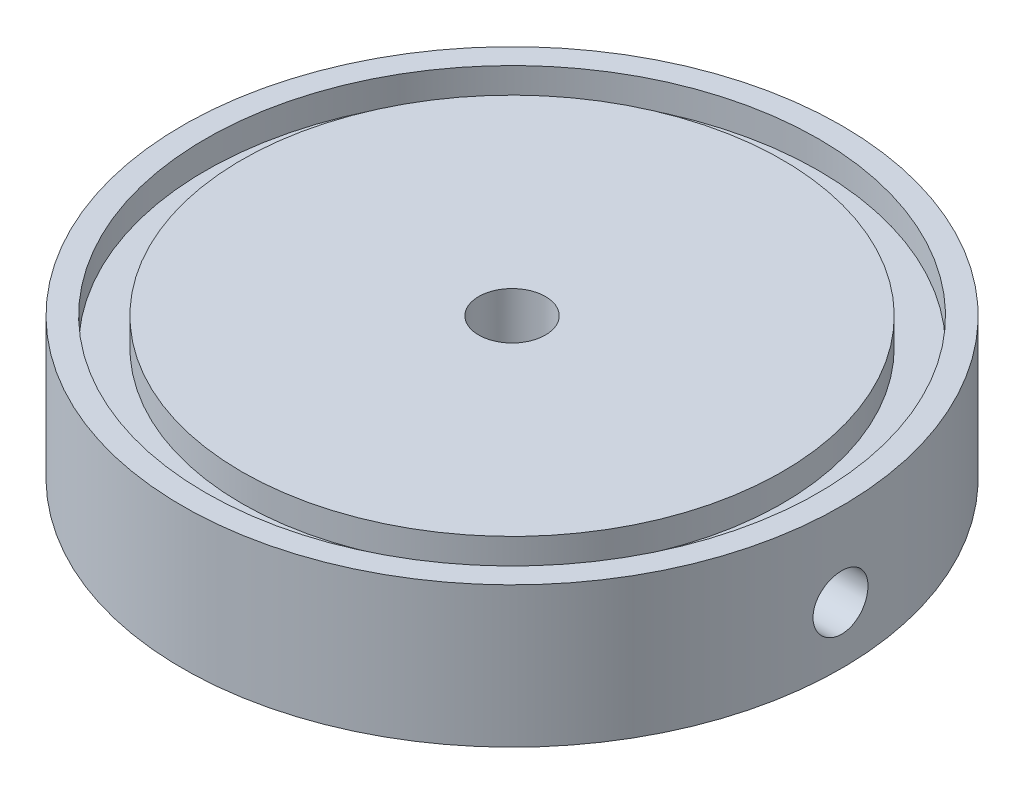
ISO-10303-21;
HEADER;
FILE_DESCRIPTION(('STEP AP214'),'2;1');
FILE_NAME('part.step','',(''),(''),'','','');
FILE_SCHEMA(('AUTOMOTIVE_DESIGN { 1 0 10303 214 1 1 1 1 }'));
ENDSEC;
DATA;
#1=APPLICATION_CONTEXT('core data for automotive mechanical design processes');
#2=APPLICATION_PROTOCOL_DEFINITION('international standard','automotive_design',2000,#1);
#3=PRODUCT_CONTEXT('',#1,'mechanical');
#4=PRODUCT('Part','Part','',(#3));
#5=PRODUCT_RELATED_PRODUCT_CATEGORY('part','',(#4));
#6=PRODUCT_DEFINITION_FORMATION('','',#4);
#7=PRODUCT_DEFINITION_CONTEXT('part definition',#1,'design');
#8=PRODUCT_DEFINITION('design','',#6,#7);
#9=PRODUCT_DEFINITION_SHAPE('','',#8);
#10=(LENGTH_UNIT() NAMED_UNIT(*) SI_UNIT(.MILLI.,.METRE.));
#11=(NAMED_UNIT(*) PLANE_ANGLE_UNIT() SI_UNIT($,.RADIAN.));
#12=(NAMED_UNIT(*) SI_UNIT($,.STERADIAN.) SOLID_ANGLE_UNIT());
#13=UNCERTAINTY_MEASURE_WITH_UNIT(LENGTH_MEASURE(1.E-05),#10,'distance_accuracy_value','');
#14=(GEOMETRIC_REPRESENTATION_CONTEXT(3) GLOBAL_UNCERTAINTY_ASSIGNED_CONTEXT((#13)) GLOBAL_UNIT_ASSIGNED_CONTEXT((#10,
#11,#12)) REPRESENTATION_CONTEXT('',''));
#15=CARTESIAN_POINT('',(0.,0.,0.));
#16=DIRECTION('',(0.,0.,1.));
#17=DIRECTION('',(1.,0.,0.));
#18=AXIS2_PLACEMENT_3D('',#15,#16,#17);
#19=CARTESIAN_POINT('',(38.1,-2.28600000000442,0.));
#20=DIRECTION('',(-1.,0.,0.));
#21=DIRECTION('',(0.,0.,1.));
#22=AXIS2_PLACEMENT_3D('',#19,#20,#21);
#23=CYLINDRICAL_SURFACE('',#22,1.7272);
#24=CARTESIAN_POINT('',(4.80191535530144,-0.723623755532479,-0.736342522682037));
#25=CARTESIAN_POINT('',(4.77186223711895,-0.695508027662611,-0.6766842015263));
#26=CARTESIAN_POINT('',(4.74519728640824,-0.670149780641417,-0.613995515617501));
#27=CARTESIAN_POINT('',(4.6997006609823,-0.62642981667209,-0.483501887721507));
#28=CARTESIAN_POINT('',(4.68086706884819,-0.608066387215166,-0.415698202892281));
#29=CARTESIAN_POINT('',(4.65179372325206,-0.579545173145753,-0.276251443595078));
#30=CARTESIAN_POINT('',(4.6415920832701,-0.569423787725918,-0.204592812198787));
#31=CARTESIAN_POINT('',(4.63040032480049,-0.558313427353962,-0.0598561049839643));
#32=CARTESIAN_POINT('',(4.62940859792253,-0.557322857825036,0.013221720757056));
#33=CARTESIAN_POINT('',(4.63649837031051,-0.564368860657253,0.154897778871572));
#34=CARTESIAN_POINT('',(4.64414058350532,-0.571968387338045,0.223540916446432));
#35=CARTESIAN_POINT('',(4.66746869161537,-0.594947638308812,0.358079653932202));
#36=CARTESIAN_POINT('',(4.68315467166714,-0.610327444946509,0.423975224754438));
#37=CARTESIAN_POINT('',(4.72228480294861,-0.648199006472655,0.55263829325285));
#38=CARTESIAN_POINT('',(4.74586430393426,-0.670814508980356,0.615327534340518));
#39=CARTESIAN_POINT('',(4.79977525029712,-0.721733582306487,0.735214922446919));
#40=CARTESIAN_POINT('',(4.83010951706252,-0.750039529476772,0.792410760603868));
#41=CARTESIAN_POINT('',(4.91171560659409,-0.824949363978454,0.925614555898395));
#42=CARTESIAN_POINT('',(4.96621899655739,-0.874001940002459,0.998266402915223));
#43=CARTESIAN_POINT('',(5.08438899156457,-0.977842273227169,1.13096632809429));
#44=CARTESIAN_POINT('',(5.14807711516609,-1.03264341394369,1.1909839703637));
#45=CARTESIAN_POINT('',(5.26566122440978,-1.13167887656766,1.28617866334988));
#46=CARTESIAN_POINT('',(5.31816196189335,-1.17523433676545,1.32384510843578));
#47=CARTESIAN_POINT('',(5.4261169706323,-1.26350787680583,1.39315518205311));
#48=CARTESIAN_POINT('',(5.48157278801267,-1.30822655886818,1.42479561732643));
#49=CARTESIAN_POINT('',(5.59481964246952,-1.39836374962955,1.4826304002712));
#50=CARTESIAN_POINT('',(5.65261363941882,-1.44378309726948,1.50881756961363));
#51=CARTESIAN_POINT('',(5.7699750773994,-1.53494562245343,1.55620542973719));
#52=CARTESIAN_POINT('',(5.82954311153864,-1.58068890431147,1.57740443127022));
#53=CARTESIAN_POINT('',(5.98717710024096,-1.70048335673669,1.62690244032982));
#54=CARTESIAN_POINT('',(6.08634802814557,-1.77460956138287,1.65152753096391));
#55=CARTESIAN_POINT('',(6.28700874920954,-1.92250418417874,1.69024645890892));
#56=CARTESIAN_POINT('',(6.38849995164998,-1.99627235001715,1.70433371068357));
#57=CARTESIAN_POINT('',(6.59314286291203,-2.1432841208424,1.72289140406074));
#58=CARTESIAN_POINT('',(6.69629836975414,-2.21652572612805,1.72733530032984));
#59=CARTESIAN_POINT('',(6.90324050283641,-2.36201675257392,1.72705850420594));
#60=CARTESIAN_POINT('',(7.00702696216003,-2.43426642096362,1.72234013875578));
#61=CARTESIAN_POINT('',(7.21970360852126,-2.58109341204515,1.70349173556486));
#62=CARTESIAN_POINT('',(7.32859504615123,-2.65561165539655,1.68891249003723));
#63=CARTESIAN_POINT('',(7.54570438106643,-2.80310160389555,1.64974277186861));
#64=CARTESIAN_POINT('',(7.65392197522599,-2.87607264418525,1.62514808362039));
#65=CARTESIAN_POINT('',(7.86826402064906,-3.01971063363882,1.5655379402369));
#66=CARTESIAN_POINT('',(7.97439588262935,-3.09038674526468,1.53057164560913));
#67=CARTESIAN_POINT('',(8.1838491117806,-3.22914165706115,1.44919744666333));
#68=CARTESIAN_POINT('',(8.28717330524154,-3.29722309918329,1.4028015602395));
#69=CARTESIAN_POINT('',(8.46831752518386,-3.41605973967605,1.30793643877834));
#70=CARTESIAN_POINT('',(8.54697361003414,-3.46747420794135,1.26190400768557));
#71=CARTESIAN_POINT('',(8.70024252765943,-3.56735971343047,1.16035288455229));
#72=CARTESIAN_POINT('',(8.77484930981358,-3.61582635826773,1.10482048488782));
#73=CARTESIAN_POINT('',(8.91850223913141,-3.70891134258468,0.982118815452525));
#74=CARTESIAN_POINT('',(8.98747637636184,-3.75348024749557,0.914825644334908));
#75=CARTESIAN_POINT('',(9.11496639800748,-3.83569241036066,0.767300634371547));
#76=CARTESIAN_POINT('',(9.17352088180981,-3.87336124539961,0.687118736553721));
#77=CARTESIAN_POINT('',(9.25236278858509,-3.92401063403261,0.550400415130571));
#78=CARTESIAN_POINT('',(9.27828734671245,-3.94064793280894,0.498488175165281));
#79=CARTESIAN_POINT('',(9.32311631436171,-3.96940010950055,0.390508248154328));
#80=CARTESIAN_POINT('',(9.34202704695845,-3.98151906082949,0.33444435886592));
#81=CARTESIAN_POINT('',(9.37137551939889,-4.00032096001182,0.218611289451272));
#82=CARTESIAN_POINT('',(9.38173056326914,-4.00695085399056,0.158811820807572));
#83=CARTESIAN_POINT('',(9.39249063016188,-4.01383999833945,0.0379647842521474));
#84=CARTESIAN_POINT('',(9.39290284191535,-4.01410385139779,-0.0230818499874414));
#85=CARTESIAN_POINT('',(9.38429478524852,-4.00859262914525,-0.136982649121262));
#86=CARTESIAN_POINT('',(9.37637140865176,-4.00351981434802,-0.189960360130125));
#87=CARTESIAN_POINT('',(9.35347280265172,-3.98885249385828,-0.293705473357298));
#88=CARTESIAN_POINT('',(9.33849356414226,-3.97925541750002,-0.344471601026274));
#89=CARTESIAN_POINT('',(9.29625961877905,-3.95217862235895,-0.460137442897521));
#90=CARTESIAN_POINT('',(9.26654309304615,-3.93311538524583,-0.523760727839246));
#91=CARTESIAN_POINT('',(9.19897910889834,-3.88971977923244,-0.644550095699817));
#92=CARTESIAN_POINT('',(9.16111369061252,-3.86537577073827,-0.701701483171564));
#93=CARTESIAN_POINT('',(9.056575694752,-3.79806787696212,-0.840053913398823));
#94=CARTESIAN_POINT('',(8.98568517045063,-3.75233622919917,-0.916684590224648));
#95=CARTESIAN_POINT('',(8.83530065490556,-3.65504160268728,-1.05651382176823));
#96=CARTESIAN_POINT('',(8.7557870238674,-3.60346529975991,-1.1196806993316));
#97=CARTESIAN_POINT('',(8.60151094562091,-3.50305694072647,-1.22748235761545));
#98=CARTESIAN_POINT('',(8.52736850811267,-3.4546686094187,-1.27344122556468));
#99=CARTESIAN_POINT('',(8.37619507889038,-3.35567742096141,-1.35765862365433));
#100=CARTESIAN_POINT('',(8.29916201576918,-3.30507297124137,-1.39591150170605));
#101=CARTESIAN_POINT('',(8.14297177933781,-3.20208173772617,-1.4655663717323));
#102=CARTESIAN_POINT('',(8.06381041600898,-3.14969137392434,-1.49695353855895));
#103=CARTESIAN_POINT('',(7.90412663631236,-3.04355936796271,-1.55336208308023));
#104=CARTESIAN_POINT('',(7.82360384997246,-2.98981735648797,-1.57838169972213));
#105=CARTESIAN_POINT('',(7.62465333608724,-2.85639639314508,-1.63253438430539));
#106=CARTESIAN_POINT('',(7.50572549425357,-2.77609169362757,-1.65831917188021));
#107=CARTESIAN_POINT('',(7.26709329620118,-2.61360201646067,-1.69790733337548));
#108=CARTESIAN_POINT('',(7.14738852653151,-2.53141596663883,-1.71170369141571));
#109=CARTESIAN_POINT('',(6.90836711801478,-2.36564748860692,-1.72736785745495));
#110=CARTESIAN_POINT('',(6.78905019109237,-2.2820667754075,-1.72924936867604));
#111=CARTESIAN_POINT('',(6.55172382287718,-2.11377996459469,-1.72065633825049));
#112=CARTESIAN_POINT('',(6.43371355926717,-2.02907465836078,-1.71019007284234));
#113=CARTESIAN_POINT('',(6.2475859081475,-1.89347450552002,-1.68279410405116));
#114=CARTESIAN_POINT('',(6.1786496781237,-1.8428039230012,-1.6702089907304));
#115=CARTESIAN_POINT('',(6.04199942265427,-1.74135230545683,-1.63993361076735));
#116=CARTESIAN_POINT('',(5.97428509737129,-1.69057130105075,-1.6222446151527));
#117=CARTESIAN_POINT('',(5.84055042879419,-1.58914184176068,-1.5813274600062));
#118=CARTESIAN_POINT('',(5.77452834148793,-1.53849330305116,-1.55810527996187));
#119=CARTESIAN_POINT('',(5.64467054836192,-1.4376020267214,-1.50554738398981));
#120=CARTESIAN_POINT('',(5.5808341103141,-1.38735915759244,-1.47621373930456));
#121=CARTESIAN_POINT('',(5.43085925880112,-1.26762727009308,-1.39755120790061));
#122=CARTESIAN_POINT('',(5.34608579946259,-1.19853104195896,-1.3449264199448));
#123=CARTESIAN_POINT('',(5.18498795367794,-1.0641869575254,-1.22413880469283));
#124=CARTESIAN_POINT('',(5.10864510383821,-0.998930843872178,-1.1560109739992));
#125=CARTESIAN_POINT('',(4.99298133712381,-0.897633697218219,-1.02942511697104));
#126=CARTESIAN_POINT('',(4.9500866502995,-0.859393215128875,-0.976001804096662));
#127=CARTESIAN_POINT('',(4.87078507788015,-0.787572846905296,-0.861674944670481));
#128=CARTESIAN_POINT('',(4.83437407294335,-0.753990004607977,-0.800776189419249));
#129=CARTESIAN_POINT('',(4.80191535530144,-0.723623755532479,-0.736342522682037));
#130=B_SPLINE_CURVE_WITH_KNOTS('',3,(#24,#25,#26,#27,#28,#29,#30,#31,#32,#33,#34,#35,#36,#37,
#38,#39,#40,#41,#42,#43,#44,#45,#46,#47,#48,#49,#50,#51,#52,#53,#54,#55,#56,#57,#58,#59,#60,#61,
#62,#63,#64,#65,#66,#67,#68,#69,#70,#71,#72,#73,#74,#75,#76,#77,#78,#79,#80,#81,#82,#83,#84,#85,
#86,#87,#88,#89,#90,#91,#92,#93,#94,#95,#96,#97,#98,#99,#100,#101,#102,#103,#104,#105,#106,#107,
#108,#109,#110,#111,#112,#113,#114,#115,#116,#117,#118,#119,#120,#121,#122,#123,#124,#125,#126,
#127,#128,#129),.UNSPECIFIED.,.T.,.F.,(4,2,2,2,2,2,2,2,2,2,2,2,2,2,2,2,2,2,2,2,2,2,2,2,2,2,2,2,
2,2,2,2,2,2,2,2,2,2,2,2,2,2,2,2,2,2,2,2,2,2,2,2,4),(0.,0.217222001562203,0.434390787433596,
0.652513528534496,0.870598176647974,1.07806764092871,1.28553930114523,1.49676809537143,
1.70808528348996,2.01602463811645,2.32469753982027,2.5581588515775,2.79174353527152,
3.02563377789516,3.25960311405534,3.63773978008851,4.01611256256732,4.39552558022503,
4.77484225082696,5.17271850944061,5.57076241182431,5.96694897615836,6.36272072633007,
6.67620388410822,6.99014324589484,7.307614875147,7.62388477717531,7.80439552449282,
7.98474314066401,8.16681418275955,8.34875358238263,8.50942683824988,8.67019149820098,
8.88725632730944,9.10480455066825,9.44480598986697,9.78559875189322,10.0844408013257,
10.3835012497851,10.6832012215607,10.9829839905336,11.4198123238719,11.8568961264702,
12.2934771491398,12.7297657145567,12.9890606267441,13.2482910219711,13.5072425379436,
13.7661064347507,14.1291594658649,14.4914009304748,14.7261601381405,14.9607696575755),.UNSPECIFIED.);
#131=CARTESIAN_POINT('',(4.80191535530144,-0.723623755532479,-0.736342522682037));
#132=VERTEX_POINT('',#131);
#133=EDGE_CURVE('E157',#132,#132,#130,.T.);
#134=ORIENTED_EDGE('',*,*,#133,.F.);
#135=EDGE_LOOP('',(#134));
#136=FACE_BOUND('',#135,.T.);
#137=CARTESIAN_POINT('',(28.575,-2.28600000000442,0.));
#138=DIRECTION('',(1.,0.,0.));
#139=DIRECTION('',(0.,0.,-1.));
#140=AXIS2_PLACEMENT_3D('',#137,#138,#139);
#141=CIRCLE('',#140,1.7272);
#142=CARTESIAN_POINT('',(28.575,-2.28600000000442,-1.7272));
#143=VERTEX_POINT('',#142);
#144=EDGE_CURVE('E53',#143,#143,#141,.T.);
#145=ORIENTED_EDGE('',*,*,#144,.T.);
#146=EDGE_LOOP('',(#145));
#147=FACE_BOUND('',#146,.T.);
#148=ADVANCED_FACE('F31',(#136,#147),#23,.F.);
#149=CARTESIAN_POINT('',(3.86080000000004,7.36599999999557,0.));
#150=DIRECTION('',(0.,1.,0.));
#151=DIRECTION('',(0.,0.,1.));
#152=AXIS2_PLACEMENT_3D('',#149,#150,#151);
#153=PLANE('',#152);
#154=CARTESIAN_POINT('',(0.,7.36599999999557,0.));
#155=DIRECTION('',(0.,-1.,0.));
#156=DIRECTION('',(0.,0.,-1.));
#157=AXIS2_PLACEMENT_3D('',#154,#155,#156);
#158=CIRCLE('',#157,3.86079999999999);
#159=CARTESIAN_POINT('',(0.,7.36599999999557,-3.86079999999999));
#160=VERTEX_POINT('',#159);
#161=EDGE_CURVE('E163',#160,#160,#158,.T.);
#162=ORIENTED_EDGE('',*,*,#161,.T.);
#163=EDGE_LOOP('',(#162));
#164=FACE_BOUND('',#163,.T.);
#165=CARTESIAN_POINT('',(0.,7.36599999999557,0.));
#166=DIRECTION('',(0.,1.,0.));
#167=DIRECTION('',(0.,0.,1.));
#168=AXIS2_PLACEMENT_3D('',#165,#166,#167);
#169=CIRCLE('',#168,31.242);
#170=CARTESIAN_POINT('',(0.,7.36599999999557,31.242));
#171=VERTEX_POINT('',#170);
#172=EDGE_CURVE('E315',#171,#171,#169,.T.);
#173=ORIENTED_EDGE('',*,*,#172,.T.);
#174=EDGE_LOOP('',(#173));
#175=FACE_BOUND('',#174,.T.);
#176=ADVANCED_FACE('F154',(#164,#175),#153,.T.);
#177=CARTESIAN_POINT('',(0.,-4.42701431069281E-12,0.));
#178=DIRECTION('',(0.,-1.,0.));
#179=DIRECTION('',(0.,0.,-1.));
#180=AXIS2_PLACEMENT_3D('',#177,#178,#179);
#181=CONICAL_SURFACE('',#180,3.86079999999999,0.943079516414084);
#182=CARTESIAN_POINT('',(0.,-0.380321888950229,0.));
#183=DIRECTION('',(0.,1.,0.));
#184=DIRECTION('',(0.,0.,1.));
#185=AXIS2_PLACEMENT_3D('',#182,#183,#184);
#186=CIRCLE('',#185,4.38493110320341);
#187=CARTESIAN_POINT('',(0.,-0.380321888950229,4.38493110320341));
#188=VERTEX_POINT('',#187);
#189=EDGE_CURVE('E10',#188,#188,#186,.T.);
#190=ORIENTED_EDGE('',*,*,#189,.T.);
#191=EDGE_LOOP('',(#190));
#192=FACE_BOUND('',#191,.T.);
#193=CARTESIAN_POINT('',(0.,-4.06400000000444,0.));
#194=DIRECTION('',(0.,-1.,0.));
#195=DIRECTION('',(0.,0.,-1.));
#196=AXIS2_PLACEMENT_3D('',#193,#194,#195);
#197=CIRCLE('',#196,9.46149999999993);
#198=CARTESIAN_POINT('',(0.,-4.06400000000444,-9.46149999999993));
#199=VERTEX_POINT('',#198);
#200=EDGE_CURVE('E46',#199,#199,#197,.T.);
#201=ORIENTED_EDGE('',*,*,#200,.T.);
#202=EDGE_LOOP('',(#201));
#203=FACE_BOUND('',#202,.T.);
#204=ORIENTED_EDGE('',*,*,#133,.T.);
#205=EDGE_LOOP('',(#204));
#206=FACE_BOUND('',#205,.T.);
#207=ADVANCED_FACE('F168',(#192,#203,#206),#181,.F.);
#208=CARTESIAN_POINT('',(0.,101.604645460313,0.));
#209=DIRECTION('',(0.,-1.,0.));
#210=DIRECTION('',(0.,0.,-1.));
#211=AXIS2_PLACEMENT_3D('',#208,#209,#210);
#212=CYLINDRICAL_SURFACE('',#211,38.1);
#213=CARTESIAN_POINT('',(37.967477859347,-2.28600000000442,-3.175));
#214=CARTESIAN_POINT('',(37.9674796148514,-2.10799137459055,-3.174992223886));
#215=CARTESIAN_POINT('',(37.9687432124493,-1.92986156393965,-3.15997936696993));
#216=CARTESIAN_POINT('',(37.9736610260084,-1.57853056040072,-3.10031123355846));
#217=CARTESIAN_POINT('',(37.9773179506743,-1.4053351842216,-3.05562236969804));
#218=CARTESIAN_POINT('',(37.9866053672743,-1.06901235231119,-2.93790365154258));
#219=CARTESIAN_POINT('',(37.9922347401669,-0.905879249473695,-2.86488986449255));
#220=CARTESIAN_POINT('',(38.0048313657025,-0.594222855211688,-2.69262246744107));
#221=CARTESIAN_POINT('',(38.0117983322355,-0.445696449684329,-2.59337446720523));
#222=CARTESIAN_POINT('',(38.0263052267685,-0.167049440268157,-2.37118060325433));
#223=CARTESIAN_POINT('',(38.033846422922,-0.0369715038395908,-2.24818130945098));
#224=CARTESIAN_POINT('',(38.0486404573867,0.2007195828014,-1.98208938314658));
#225=CARTESIAN_POINT('',(38.0558932830885,0.308331751528685,-1.83899587322542));
#226=CARTESIAN_POINT('',(38.0693053861151,0.498178501528936,-1.53652297885541));
#227=CARTESIAN_POINT('',(38.0754630672337,0.580376167096676,-1.3771203474996));
#228=CARTESIAN_POINT('',(38.0859774147698,0.716824484296814,-1.04671622158357));
#229=CARTESIAN_POINT('',(38.0903341127107,0.771075625094883,-0.875714930101311));
#230=CARTESIAN_POINT('',(38.0967467506224,0.849968086238491,-0.527392252134298));
#231=CARTESIAN_POINT('',(38.0988080535635,0.874678435799821,-0.350086600537618));
#232=CARTESIAN_POINT('',(38.1004158213117,0.894001270106652,0.00616674500017873));
#233=CARTESIAN_POINT('',(38.0999623328846,0.888614314552522,0.185114408344069));
#234=CARTESIAN_POINT('',(38.0965960392816,0.847951910326072,0.539104051072239));
#235=CARTESIAN_POINT('',(38.0936893421403,0.812750692867242,0.714154623480081));
#236=CARTESIAN_POINT('',(38.0857505953842,0.713574420690951,1.05585407967778));
#237=CARTESIAN_POINT('',(38.0807185255475,0.649599092201483,1.22250288351202));
#238=CARTESIAN_POINT('',(38.0690846412153,0.494607890894126,1.54290446002202));
#239=CARTESIAN_POINT('',(38.0624808988053,0.40355877314451,1.69664107794224));
#240=CARTESIAN_POINT('',(38.0484457872988,0.197028683983461,1.98667794141065));
#241=CARTESIAN_POINT('',(38.0410144014161,0.0815472169947486,2.12297783318834));
#242=CARTESIAN_POINT('',(38.0261325057258,-0.170987846862343,2.37470621318252));
#243=CARTESIAN_POINT('',(38.0186820064471,-0.308105945954129,2.49007000291146));
#244=CARTESIAN_POINT('',(38.004624326273,-0.599797203748761,2.69615157657959));
#245=CARTESIAN_POINT('',(37.9980171460728,-0.754370376840316,2.78686934020215));
#246=CARTESIAN_POINT('',(37.9863929785793,-1.07662944367989,2.94108125458357));
#247=CARTESIAN_POINT('',(37.9813761874432,-1.24431695176081,3.00457204753268));
#248=CARTESIAN_POINT('',(37.9735046116395,-1.58802297981634,3.10247984731552));
#249=CARTESIAN_POINT('',(37.9706497815192,-1.76404132456204,3.136897465381));
#250=CARTESIAN_POINT('',(37.967432729465,-2.11884636731748,3.17560002074756));
#251=CARTESIAN_POINT('',(37.9670630442667,-2.29762315889829,3.17997518092429));
#252=CARTESIAN_POINT('',(37.9688384390387,-2.653367641092,3.15870496351731));
#253=CARTESIAN_POINT('',(37.9709834955532,-2.8303353485634,3.13305986594426));
#254=CARTESIAN_POINT('',(37.9775398735957,-3.17717917966798,3.05255231894487));
#255=CARTESIAN_POINT('',(37.981947928906,-3.34706514343725,2.99773197439151));
#256=CARTESIAN_POINT('',(37.9925309166028,-3.6752278608743,2.86047288657974));
#257=CARTESIAN_POINT('',(37.9987058773397,-3.83350442821541,2.77803370016694));
#258=CARTESIAN_POINT('',(38.0121450024562,-4.13436832580058,2.58764877433316));
#259=CARTESIAN_POINT('',(38.0194117192608,-4.27691749516941,2.47964291244999));
#260=CARTESIAN_POINT('',(38.0342069443176,-4.54189446238362,2.24127735771924));
#261=CARTESIAN_POINT('',(38.0417354570727,-4.66432191391979,2.11091728021842));
#262=CARTESIAN_POINT('',(38.0562282152053,-4.8858881383243,1.83115385899478));
#263=CARTESIAN_POINT('',(38.0631910120889,-4.98496829078934,1.68170400390121));
#264=CARTESIAN_POINT('',(38.0757469329061,-5.15662517557185,1.36823511345573));
#265=CARTESIAN_POINT('',(38.0813400705265,-5.22920217273458,1.20421622371214));
#266=CARTESIAN_POINT('',(38.0905198062144,-5.34569188167546,0.866475212585344));
#267=CARTESIAN_POINT('',(38.0941089410165,-5.38964084359246,0.692765665902923));
#268=CARTESIAN_POINT('',(38.0988865697222,-5.44774540927367,0.340401843535497));
#269=CARTESIAN_POINT('',(38.1000751090659,-5.46190157697817,0.161747661511104));
#270=CARTESIAN_POINT('',(38.0999176999799,-5.46001213177132,-0.19485625365699));
#271=CARTESIAN_POINT('',(38.0985794181538,-5.44405787666705,-0.372806481371152));
#272=CARTESIAN_POINT('',(38.0935339028085,-5.38259097943029,-0.723490780794735));
#273=CARTESIAN_POINT('',(38.0898266660717,-5.33707829715076,-0.896224845419092));
#274=CARTESIAN_POINT('',(38.0804591991,-5.21780969986591,-1.23157947247479));
#275=CARTESIAN_POINT('',(38.0747990823493,-5.14405542598607,-1.39420062193183));
#276=CARTESIAN_POINT('',(38.0621590787552,-4.97040774586677,-1.7047672689544));
#277=CARTESIAN_POINT('',(38.055179212783,-4.87051475298898,-1.85271299854823));
#278=CARTESIAN_POINT('',(38.0406579324267,-4.64708235285857,-2.13019668392583));
#279=CARTESIAN_POINT('',(38.0331149513177,-4.52347534677913,-2.25968012625115));
#280=CARTESIAN_POINT('',(38.0183309031222,-4.25624571429949,-2.49611459932655));
#281=CARTESIAN_POINT('',(38.0110899095966,-4.11261824769125,-2.60306016549813));
#282=CARTESIAN_POINT('',(37.9977149749742,-3.80914592277891,-2.79152787825786));
#283=CARTESIAN_POINT('',(37.9915831336506,-3.64927118125046,-2.87300201198062));
#284=CARTESIAN_POINT('',(37.9811464024721,-3.31816888837208,-3.00784546046481));
#285=CARTESIAN_POINT('',(37.9768394132918,-3.14695464582989,-3.0612470872011));
#286=CARTESIAN_POINT('',(37.971647709959,-2.85994194258297,-3.1248289611693));
#287=CARTESIAN_POINT('',(37.9700912043148,-2.74598938743211,-3.14361809063546));
#288=CARTESIAN_POINT('',(37.9680057114582,-2.51670818992462,-3.16870611338372));
#289=CARTESIAN_POINT('',(37.9674767214846,-2.40137955126678,-3.17500504023073));
#290=CARTESIAN_POINT('',(37.967477859347,-2.28600000000442,-3.175));
#291=B_SPLINE_CURVE_WITH_KNOTS('',3,(#213,#214,#215,#216,#217,#218,#219,#220,#221,#222,#223,
#224,#225,#226,#227,#228,#229,#230,#231,#232,#233,#234,#235,#236,#237,#238,#239,#240,#241,#242,
#243,#244,#245,#246,#247,#248,#249,#250,#251,#252,#253,#254,#255,#256,#257,#258,#259,#260,#261,
#262,#263,#264,#265,#266,#267,#268,#269,#270,#271,#272,#273,#274,#275,#276,#277,#278,#279,#280,
#281,#282,#283,#284,#285,#286,#287,#288,#289,#290),.UNSPECIFIED.,.T.,.F.,(4,2,2,2,2,2,2,2,2,2,2,
2,2,2,2,2,2,2,2,2,2,2,2,2,2,2,2,2,2,2,2,2,2,2,2,2,2,2,4),(0.,0.533604603517507,1.06781417349037,
1.60172115641093,2.13551406411709,2.67052206526965,3.2055534349789,3.74135834978334,
4.27715388573729,4.81169494296257,5.34622605970217,5.87943020597204,6.41263942553357,
6.94650611589526,7.4803836360617,8.01588389273743,8.55138459084429,9.08695131145285,
9.62250677207596,10.1564531576629,10.6903945629631,11.2235674807547,11.7567489539102,
12.2911969327788,12.8256541089181,13.3614392326626,13.8972190021753,14.4323190169852,
14.9674089029308,15.5008778862256,16.0343475940937,16.5677863066157,17.1012165837663,
17.6361906712906,18.1712943208452,18.7074006261176,19.2428885044878,19.5887550320897,
19.9346206302438),.UNSPECIFIED.);
#292=CARTESIAN_POINT('',(37.967477859347,-2.28600000000442,-3.175));
#293=VERTEX_POINT('',#292);
#294=EDGE_CURVE('E42',#293,#293,#291,.T.);
#295=ORIENTED_EDGE('',*,*,#294,.F.);
#296=EDGE_LOOP('',(#295));
#297=FACE_BOUND('',#296,.T.);
#298=CARTESIAN_POINT('',(0.,7.36599999999557,0.));
#299=DIRECTION('',(0.,-1.,0.));
#300=DIRECTION('',(0.,0.,-1.));
#301=AXIS2_PLACEMENT_3D('',#298,#299,#300);
#302=CIRCLE('',#301,38.1);
#303=CARTESIAN_POINT('',(0.,7.36599999999557,-38.1));
#304=VERTEX_POINT('',#303);
#305=EDGE_CURVE('E251',#304,#304,#302,.T.);
#306=ORIENTED_EDGE('',*,*,#305,.T.);
#307=EDGE_LOOP('',(#306));
#308=FACE_BOUND('',#307,.T.);
#309=CARTESIAN_POINT('',(0.,-8.89000000000442,0.));
#310=DIRECTION('',(0.,-1.,0.));
#311=DIRECTION('',(0.,0.,-1.));
#312=AXIS2_PLACEMENT_3D('',#309,#310,#311);
#313=CIRCLE('',#312,38.1);
#314=CARTESIAN_POINT('',(0.,-8.89000000000442,-38.1));
#315=VERTEX_POINT('',#314);
#316=EDGE_CURVE('E242',#315,#315,#313,.T.);
#317=ORIENTED_EDGE('',*,*,#316,.F.);
#318=EDGE_LOOP('',(#317));
#319=FACE_BOUND('',#318,.T.);
#320=ADVANCED_FACE('F55',(#297,#308,#319),#212,.T.);
#321=CARTESIAN_POINT('',(0.,-6.391948453042,0.));
#322=DIRECTION('',(0.,-1.,0.));
#323=DIRECTION('',(0.,0.,-1.));
#324=AXIS2_PLACEMENT_3D('',#321,#322,#323);
#325=TOROIDAL_SURFACE('',#324,8.44549999999992,2.54);
#326=CARTESIAN_POINT('',(0.,-6.391948453042,0.));
#327=DIRECTION('',(0.,-1.,0.));
#328=DIRECTION('',(0.,0.,-1.));
#329=AXIS2_PLACEMENT_3D('',#326,#327,#328);
#330=CIRCLE('',#329,10.9854999999999);
#331=CARTESIAN_POINT('',(0.,-6.391948453042,-10.9854999999999));
#332=VERTEX_POINT('',#331);
#333=EDGE_CURVE('E262',#332,#332,#330,.T.);
#334=ORIENTED_EDGE('',*,*,#333,.T.);
#335=EDGE_LOOP('',(#334));
#336=FACE_BOUND('',#335,.T.);
#337=ORIENTED_EDGE('',*,*,#200,.F.);
#338=EDGE_LOOP('',(#337));
#339=FACE_BOUND('',#338,.T.);
#340=ADVANCED_FACE('F172',(#336,#339),#325,.F.);
#341=CARTESIAN_POINT('',(0.,101.604645460313,0.));
#342=DIRECTION('',(0.,-1.,0.));
#343=DIRECTION('',(0.,0.,-1.));
#344=AXIS2_PLACEMENT_3D('',#341,#342,#343);
#345=CYLINDRICAL_SURFACE('',#344,10.9854999999999);
#346=CARTESIAN_POINT('',(0.,-8.89000000000444,0.));
#347=DIRECTION('',(0.,-1.,0.));
#348=DIRECTION('',(0.,0.,-1.));
#349=AXIS2_PLACEMENT_3D('',#346,#347,#348);
#350=CIRCLE('',#349,10.9854999999999);
#351=CARTESIAN_POINT('',(0.,-8.89000000000444,-10.9854999999999));
#352=VERTEX_POINT('',#351);
#353=EDGE_CURVE('E259',#352,#352,#350,.T.);
#354=ORIENTED_EDGE('',*,*,#353,.T.);
#355=EDGE_LOOP('',(#354));
#356=FACE_BOUND('',#355,.T.);
#357=ORIENTED_EDGE('',*,*,#333,.F.);
#358=EDGE_LOOP('',(#357));
#359=FACE_BOUND('',#358,.T.);
#360=ADVANCED_FACE('F175',(#356,#359),#345,.F.);
#361=CARTESIAN_POINT('',(10.9855,-8.89000000000443,0.));
#362=DIRECTION('',(0.,-1.,0.));
#363=DIRECTION('',(0.,0.,-1.));
#364=AXIS2_PLACEMENT_3D('',#361,#362,#363);
#365=PLANE('',#364);
#366=CARTESIAN_POINT('',(0.,-8.89000000000442,0.));
#367=DIRECTION('',(0.,-1.,0.));
#368=DIRECTION('',(0.,0.,-1.));
#369=AXIS2_PLACEMENT_3D('',#366,#367,#368);
#370=CIRCLE('',#369,21.1454999999999);
#371=CARTESIAN_POINT('',(0.,-8.89000000000442,-21.1454999999999));
#372=VERTEX_POINT('',#371);
#373=EDGE_CURVE('E256',#372,#372,#370,.T.);
#374=ORIENTED_EDGE('',*,*,#373,.T.);
#375=EDGE_LOOP('',(#374));
#376=FACE_BOUND('',#375,.T.);
#377=ORIENTED_EDGE('',*,*,#353,.F.);
#378=EDGE_LOOP('',(#377));
#379=FACE_BOUND('',#378,.T.);
#380=ADVANCED_FACE('F179',(#376,#379),#365,.T.);
#381=CARTESIAN_POINT('',(0.,101.604645460313,0.));
#382=DIRECTION('',(0.,-1.,0.));
#383=DIRECTION('',(0.,0.,-1.));
#384=AXIS2_PLACEMENT_3D('',#381,#382,#383);
#385=CYLINDRICAL_SURFACE('',#384,21.1454999999999);
#386=CARTESIAN_POINT('',(0.,-7.87400000000443,0.));
#387=DIRECTION('',(0.,-1.,0.));
#388=DIRECTION('',(0.,0.,-1.));
#389=AXIS2_PLACEMENT_3D('',#386,#387,#388);
#390=CIRCLE('',#389,21.1454999999999);
#391=CARTESIAN_POINT('',(0.,-7.87400000000443,-21.1454999999999));
#392=VERTEX_POINT('',#391);
#393=EDGE_CURVE('E249',#392,#392,#390,.T.);
#394=ORIENTED_EDGE('',*,*,#393,.T.);
#395=EDGE_LOOP('',(#394));
#396=FACE_BOUND('',#395,.T.);
#397=ORIENTED_EDGE('',*,*,#373,.F.);
#398=EDGE_LOOP('',(#397));
#399=FACE_BOUND('',#398,.T.);
#400=ADVANCED_FACE('F183',(#396,#399),#385,.T.);
#401=CARTESIAN_POINT('',(21.1455,-7.87400000000443,0.));
#402=DIRECTION('',(0.,-1.,0.));
#403=DIRECTION('',(0.,0.,-1.));
#404=AXIS2_PLACEMENT_3D('',#401,#402,#403);
#405=PLANE('',#404);
#406=CARTESIAN_POINT('',(0.,-7.87400000000443,0.));
#407=DIRECTION('',(0.,-1.,0.));
#408=DIRECTION('',(0.,0.,-1.));
#409=AXIS2_PLACEMENT_3D('',#406,#407,#408);
#410=CIRCLE('',#409,22.6694999999999);
#411=CARTESIAN_POINT('',(0.,-7.87400000000443,-22.6694999999999));
#412=VERTEX_POINT('',#411);
#413=EDGE_CURVE('E246',#412,#412,#410,.T.);
#414=ORIENTED_EDGE('',*,*,#413,.T.);
#415=EDGE_LOOP('',(#414));
#416=FACE_BOUND('',#415,.T.);
#417=ORIENTED_EDGE('',*,*,#393,.F.);
#418=EDGE_LOOP('',(#417));
#419=FACE_BOUND('',#418,.T.);
#420=ADVANCED_FACE('F187',(#416,#419),#405,.T.);
#421=CARTESIAN_POINT('',(0.,101.604645460313,0.));
#422=DIRECTION('',(0.,-1.,0.));
#423=DIRECTION('',(0.,0.,-1.));
#424=AXIS2_PLACEMENT_3D('',#421,#422,#423);
#425=CYLINDRICAL_SURFACE('',#424,22.6694999999999);
#426=CARTESIAN_POINT('',(0.,-8.89000000000442,0.));
#427=DIRECTION('',(0.,-1.,0.));
#428=DIRECTION('',(0.,0.,-1.));
#429=AXIS2_PLACEMENT_3D('',#426,#427,#428);
#430=CIRCLE('',#429,22.6694999999999);
#431=CARTESIAN_POINT('',(0.,-8.89000000000442,-22.6694999999999));
#432=VERTEX_POINT('',#431);
#433=EDGE_CURVE('E245',#432,#432,#430,.T.);
#434=ORIENTED_EDGE('',*,*,#433,.T.);
#435=EDGE_LOOP('',(#434));
#436=FACE_BOUND('',#435,.T.);
#437=ORIENTED_EDGE('',*,*,#413,.F.);
#438=EDGE_LOOP('',(#437));
#439=FACE_BOUND('',#438,.T.);
#440=ADVANCED_FACE('F191',(#436,#439),#425,.F.);
#441=CARTESIAN_POINT('',(22.6695,-8.89000000000442,0.));
#442=DIRECTION('',(0.,-1.,0.));
#443=DIRECTION('',(0.,0.,-1.));
#444=AXIS2_PLACEMENT_3D('',#441,#442,#443);
#445=PLANE('',#444);
#446=CARTESIAN_POINT('',(-4.85173008401352,-8.89000000000442,-27.5155286191612));
#447=DIRECTION('',(0.,-1.,0.));
#448=DIRECTION('',(-0.64278760968653,0.,-0.766044443118986));
#449=AXIS2_PLACEMENT_3D('',#446,#447,#448);
#450=CIRCLE('',#449,1.03251);
#451=CARTESIAN_POINT('',(-5.51541471889096,-8.89000000000442,-28.306477167126));
#452=VERTEX_POINT('',#451);
#453=EDGE_CURVE('E206',#452,#452,#450,.T.);
#454=ORIENTED_EDGE('',*,*,#453,.F.);
#455=EDGE_LOOP('',(#454));
#456=FACE_BOUND('',#455,.T.);
#457=CARTESIAN_POINT('',(-21.403281740744,-8.89000000000442,-17.9594858146423));
#458=DIRECTION('',(0.,-1.,0.));
#459=DIRECTION('',(-0.984807753012206,0.,-0.17364817766694));
#460=AXIS2_PLACEMENT_3D('',#457,#458,#459);
#461=CIRCLE('',#460,1.03251);
#462=CARTESIAN_POINT('',(-22.4201055938066,-8.89000000000442,-18.1387792945652));
#463=VERTEX_POINT('',#462);
#464=EDGE_CURVE('E210',#463,#463,#461,.T.);
#465=ORIENTED_EDGE('',*,*,#464,.F.);
#466=EDGE_LOOP('',(#465));
#467=FACE_BOUND('',#466,.T.);
#468=CARTESIAN_POINT('',(-27.94,-8.89000000000442,-4.47558656802016E-13));
#469=DIRECTION('',(0.,-1.,0.));
#470=DIRECTION('',(-0.866025403784443,0.,0.499999999999992));
#471=AXIS2_PLACEMENT_3D('',#468,#469,#470);
#472=CIRCLE('',#471,1.03251);
#473=CARTESIAN_POINT('',(-28.8341798896615,-8.89000000000442,0.516254999999544));
#474=VERTEX_POINT('',#473);
#475=EDGE_CURVE('E214',#474,#474,#472,.T.);
#476=ORIENTED_EDGE('',*,*,#475,.F.);
#477=EDGE_LOOP('',(#476));
#478=FACE_BOUND('',#477,.T.);
#479=CARTESIAN_POINT('',(-21.4032817407445,-8.89000000000442,17.9594858146416));
#480=DIRECTION('',(0.,-1.,0.));
#481=DIRECTION('',(-0.342020143325676,0.,0.939692620785906));
#482=AXIS2_PLACEMENT_3D('',#479,#480,#481);
#483=CIRCLE('',#482,1.03251);
#484=CARTESIAN_POINT('',(-21.7564209589297,-8.89000000000442,18.9297278425293));
#485=VERTEX_POINT('',#484);
#486=EDGE_CURVE('E218',#485,#485,#483,.T.);
#487=ORIENTED_EDGE('',*,*,#486,.F.);
#488=EDGE_LOOP('',(#487));
#489=FACE_BOUND('',#488,.T.);
#490=CARTESIAN_POINT('',(-4.85173008401439,-8.89000000000442,27.5155286191611));
#491=DIRECTION('',(0.,-1.,0.));
#492=DIRECTION('',(0.342020143325663,0.,0.939692620785911));
#493=AXIS2_PLACEMENT_3D('',#490,#491,#492);
#494=CIRCLE('',#493,1.03251);
#495=CARTESIAN_POINT('',(-4.49859086582921,-8.89000000000442,28.4857706470487));
#496=VERTEX_POINT('',#495);
#497=EDGE_CURVE('E222',#496,#496,#494,.T.);
#498=ORIENTED_EDGE('',*,*,#497,.F.);
#499=EDGE_LOOP('',(#498));
#500=FACE_BOUND('',#499,.T.);
#501=CARTESIAN_POINT('',(13.9699999999997,-8.89000000000442,24.1967497817374));
#502=DIRECTION('',(0.,-1.,0.));
#503=DIRECTION('',(0.866025403784436,0.,0.500000000000004));
#504=AXIS2_PLACEMENT_3D('',#501,#502,#503);
#505=CIRCLE('',#504,1.03251);
#506=CARTESIAN_POINT('',(14.8641798896612,-8.89000000000442,24.7130047817374));
#507=VERTEX_POINT('',#506);
#508=EDGE_CURVE('E226',#507,#507,#505,.T.);
#509=ORIENTED_EDGE('',*,*,#508,.F.);
#510=EDGE_LOOP('',(#509));
#511=FACE_BOUND('',#510,.T.);
#512=CARTESIAN_POINT('',(26.2550118247582,-8.89000000000442,9.55604280451945));
#513=DIRECTION('',(0.,-1.,0.));
#514=DIRECTION('',(0.984807753012209,0.,-0.173648177666927));
#515=AXIS2_PLACEMENT_3D('',#512,#513,#514);
#516=CIRCLE('',#515,1.03251);
#517=CARTESIAN_POINT('',(27.2718356778208,-8.89000000000442,9.37674932459657));
#518=VERTEX_POINT('',#517);
#519=EDGE_CURVE('E230',#518,#518,#516,.T.);
#520=ORIENTED_EDGE('',*,*,#519,.F.);
#521=EDGE_LOOP('',(#520));
#522=FACE_BOUND('',#521,.T.);
#523=CARTESIAN_POINT('',(26.2550118247584,-8.89000000000442,-9.55604280451898));
#524=DIRECTION('',(0.,-1.,0.));
#525=DIRECTION('',(0.642787609686541,0.,-0.766044443118977));
#526=AXIS2_PLACEMENT_3D('',#523,#524,#525);
#527=CIRCLE('',#526,1.03251);
#528=CARTESIAN_POINT('',(26.9186964596358,-8.89000000000442,-10.3469913524838));
#529=VERTEX_POINT('',#528);
#530=EDGE_CURVE('E234',#529,#529,#527,.T.);
#531=ORIENTED_EDGE('',*,*,#530,.F.);
#532=EDGE_LOOP('',(#531));
#533=FACE_BOUND('',#532,.T.);
#534=CARTESIAN_POINT('',(13.9700000000002,-8.89000000000442,-24.1967497817372));
#535=DIRECTION('',(0.,-1.,0.));
#536=DIRECTION('',(0.,0.,-1.));
#537=AXIS2_PLACEMENT_3D('',#534,#535,#536);
#538=CIRCLE('',#537,1.03251);
#539=CARTESIAN_POINT('',(13.9700000000002,-8.89000000000442,-25.2292597817372));
#540=VERTEX_POINT('',#539);
#541=EDGE_CURVE('E238',#540,#540,#538,.T.);
#542=ORIENTED_EDGE('',*,*,#541,.F.);
#543=EDGE_LOOP('',(#542));
#544=FACE_BOUND('',#543,.T.);
#545=ORIENTED_EDGE('',*,*,#316,.T.);
#546=EDGE_LOOP('',(#545));
#547=FACE_BOUND('',#546,.T.);
#548=ORIENTED_EDGE('',*,*,#433,.F.);
#549=EDGE_LOOP('',(#548));
#550=FACE_BOUND('',#549,.T.);
#551=ADVANCED_FACE('F194',(#456,#467,#478,#489,#500,#511,#522,#533,#544,#547,#550),#445,.T.);
#552=CARTESIAN_POINT('',(0.,7.36599999999557,0.));
#553=DIRECTION('',(0.,1.,0.));
#554=DIRECTION('',(0.,0.,1.));
#555=AXIS2_PLACEMENT_3D('',#552,#553,#554);
#556=CIRCLE('',#555,35.433);
#557=CARTESIAN_POINT('',(0.,7.36599999999557,35.433));
#558=VERTEX_POINT('',#557);
#559=EDGE_CURVE('E165',#558,#558,#556,.T.);
#560=ORIENTED_EDGE('',*,*,#559,.F.);
#561=EDGE_LOOP('',(#560));
#562=FACE_BOUND('',#561,.T.);
#563=ORIENTED_EDGE('',*,*,#305,.F.);
#564=EDGE_LOOP('',(#563));
#565=FACE_BOUND('',#564,.T.);
#566=ADVANCED_FACE('F197',(#562,#565),#153,.T.);
#567=CARTESIAN_POINT('',(0.,101.604645460313,0.));
#568=DIRECTION('',(0.,-1.,0.));
#569=DIRECTION('',(0.,0.,-1.));
#570=AXIS2_PLACEMENT_3D('',#567,#568,#569);
#571=CYLINDRICAL_SURFACE('',#570,3.86079999999999);
#572=CARTESIAN_POINT('',(0.,0.647578684447536,0.));
#573=DIRECTION('',(0.,1.,0.));
#574=DIRECTION('',(0.,0.,1.));
#575=AXIS2_PLACEMENT_3D('',#572,#573,#574);
#576=CIRCLE('',#575,3.86079999999999);
#577=CARTESIAN_POINT('',(0.,0.647578684447536,3.86079999999999));
#578=VERTEX_POINT('',#577);
#579=EDGE_CURVE('E38',#578,#578,#576,.F.);
#580=ORIENTED_EDGE('',*,*,#579,.T.);
#581=EDGE_LOOP('',(#580));
#582=FACE_BOUND('',#581,.T.);
#583=ORIENTED_EDGE('',*,*,#161,.F.);
#584=EDGE_LOOP('',(#583));
#585=FACE_BOUND('',#584,.T.);
#586=ADVANCED_FACE('F149',(#582,#585),#571,.F.);
#587=CARTESIAN_POINT('',(0.,4.19099999999557,0.));
#588=DIRECTION('',(0.,1.,0.));
#589=DIRECTION('',(0.,0.,1.));
#590=AXIS2_PLACEMENT_3D('',#587,#588,#589);
#591=CYLINDRICAL_SURFACE('',#590,35.433);
#592=CARTESIAN_POINT('',(0.,4.19099999999557,0.));
#593=DIRECTION('',(0.,1.,0.));
#594=DIRECTION('',(0.,0.,1.));
#595=AXIS2_PLACEMENT_3D('',#592,#593,#594);
#596=CIRCLE('',#595,35.433);
#597=CARTESIAN_POINT('',(0.,4.19099999999557,35.433));
#598=VERTEX_POINT('',#597);
#599=EDGE_CURVE('E164',#598,#598,#596,.T.);
#600=ORIENTED_EDGE('',*,*,#599,.F.);
#601=EDGE_LOOP('',(#600));
#602=FACE_BOUND('',#601,.T.);
#603=ORIENTED_EDGE('',*,*,#559,.T.);
#604=EDGE_LOOP('',(#603));
#605=FACE_BOUND('',#604,.T.);
#606=ADVANCED_FACE('F145',(#602,#605),#591,.F.);
#607=CARTESIAN_POINT('',(0.,4.19099999999557,0.));
#608=DIRECTION('',(0.,1.,0.));
#609=DIRECTION('',(0.,0.,1.));
#610=AXIS2_PLACEMENT_3D('',#607,#608,#609);
#611=PLANE('',#610);
#612=CARTESIAN_POINT('',(0.,4.19099999999557,0.));
#613=DIRECTION('',(0.,1.,0.));
#614=DIRECTION('',(0.,0.,1.));
#615=AXIS2_PLACEMENT_3D('',#612,#613,#614);
#616=CIRCLE('',#615,31.242);
#617=CARTESIAN_POINT('',(0.,4.19099999999557,31.242));
#618=VERTEX_POINT('',#617);
#619=EDGE_CURVE('E317',#618,#618,#616,.T.);
#620=ORIENTED_EDGE('',*,*,#619,.F.);
#621=EDGE_LOOP('',(#620));
#622=FACE_BOUND('',#621,.T.);
#623=ORIENTED_EDGE('',*,*,#599,.T.);
#624=EDGE_LOOP('',(#623));
#625=FACE_BOUND('',#624,.T.);
#626=ADVANCED_FACE('F141',(#622,#625),#611,.T.);
#627=CARTESIAN_POINT('',(0.,4.19099999999557,0.));
#628=DIRECTION('',(0.,1.,0.));
#629=DIRECTION('',(0.,0.,1.));
#630=AXIS2_PLACEMENT_3D('',#627,#628,#629);
#631=CYLINDRICAL_SURFACE('',#630,31.242);
#632=ORIENTED_EDGE('',*,*,#619,.T.);
#633=EDGE_LOOP('',(#632));
#634=FACE_BOUND('',#633,.T.);
#635=ORIENTED_EDGE('',*,*,#172,.F.);
#636=EDGE_LOOP('',(#635));
#637=FACE_BOUND('',#636,.T.);
#638=ADVANCED_FACE('F137',(#634,#637),#631,.T.);
#639=CARTESIAN_POINT('',(13.9700000000002,-5.71500000000442,-24.1967497817372));
#640=DIRECTION('',(0.,-1.,0.));
#641=DIRECTION('',(0.,0.,-1.));
#642=AXIS2_PLACEMENT_3D('',#639,#640,#641);
#643=CYLINDRICAL_SURFACE('',#642,1.03251);
#644=CARTESIAN_POINT('',(13.9700000000002,-5.71500000000442,-24.1967497817372));
#645=DIRECTION('',(0.,-1.,0.));
#646=DIRECTION('',(0.,0.,-1.));
#647=AXIS2_PLACEMENT_3D('',#644,#645,#646);
#648=CIRCLE('',#647,1.03251);
#649=CARTESIAN_POINT('',(13.9700000000002,-5.71500000000442,-25.2292597817372));
#650=VERTEX_POINT('',#649);
#651=EDGE_CURVE('E312',#650,#650,#648,.T.);
#652=ORIENTED_EDGE('',*,*,#651,.F.);
#653=EDGE_LOOP('',(#652));
#654=FACE_BOUND('',#653,.T.);
#655=ORIENTED_EDGE('',*,*,#541,.T.);
#656=EDGE_LOOP('',(#655));
#657=FACE_BOUND('',#656,.T.);
#658=ADVANCED_FACE('F133',(#654,#657),#643,.F.);
#659=CARTESIAN_POINT('',(13.9700000000002,-5.71500000000442,-24.1967497817372));
#660=DIRECTION('',(0.,-1.,0.));
#661=DIRECTION('',(0.,0.,-1.));
#662=AXIS2_PLACEMENT_3D('',#659,#660,#661);
#663=PLANE('',#662);
#664=ORIENTED_EDGE('',*,*,#651,.T.);
#665=EDGE_LOOP('',(#664));
#666=FACE_BOUND('',#665,.T.);
#667=ADVANCED_FACE('F129',(#666),#663,.T.);
#668=CARTESIAN_POINT('',(26.2550118247584,-5.71500000000442,-9.55604280451898));
#669=DIRECTION('',(0.,-1.,0.));
#670=DIRECTION('',(0.,0.,-1.));
#671=AXIS2_PLACEMENT_3D('',#668,#669,#670);
#672=CYLINDRICAL_SURFACE('',#671,1.03251);
#673=CARTESIAN_POINT('',(26.2550118247584,-5.71500000000442,-9.55604280451898));
#674=DIRECTION('',(0.,-1.,0.));
#675=DIRECTION('',(0.642787609686541,0.,-0.766044443118977));
#676=AXIS2_PLACEMENT_3D('',#673,#674,#675);
#677=CIRCLE('',#676,1.03251);
#678=CARTESIAN_POINT('',(26.9186964596358,-5.71500000000442,-10.3469913524838));
#679=VERTEX_POINT('',#678);
#680=EDGE_CURVE('E308',#679,#679,#677,.T.);
#681=ORIENTED_EDGE('',*,*,#680,.F.);
#682=EDGE_LOOP('',(#681));
#683=FACE_BOUND('',#682,.T.);
#684=ORIENTED_EDGE('',*,*,#530,.T.);
#685=EDGE_LOOP('',(#684));
#686=FACE_BOUND('',#685,.T.);
#687=ADVANCED_FACE('F125',(#683,#686),#672,.F.);
#688=CARTESIAN_POINT('',(26.2550118247584,-5.71500000000442,-9.55604280451898));
#689=DIRECTION('',(0.,-1.,0.));
#690=DIRECTION('',(0.642787609686541,0.,-0.766044443118977));
#691=AXIS2_PLACEMENT_3D('',#688,#689,#690);
#692=PLANE('',#691);
#693=ORIENTED_EDGE('',*,*,#680,.T.);
#694=EDGE_LOOP('',(#693));
#695=FACE_BOUND('',#694,.T.);
#696=ADVANCED_FACE('F121',(#695),#692,.T.);
#697=CARTESIAN_POINT('',(26.2550118247582,-5.71500000000442,9.55604280451945));
#698=DIRECTION('',(0.,-1.,0.));
#699=DIRECTION('',(0.,0.,-1.));
#700=AXIS2_PLACEMENT_3D('',#697,#698,#699);
#701=CYLINDRICAL_SURFACE('',#700,1.03251);
#702=CARTESIAN_POINT('',(26.2550118247582,-5.71500000000442,9.55604280451945));
#703=DIRECTION('',(0.,-1.,0.));
#704=DIRECTION('',(0.984807753012209,0.,-0.173648177666927));
#705=AXIS2_PLACEMENT_3D('',#702,#703,#704);
#706=CIRCLE('',#705,1.03251);
#707=CARTESIAN_POINT('',(27.2718356778208,-5.71500000000442,9.37674932459657));
#708=VERTEX_POINT('',#707);
#709=EDGE_CURVE('E304',#708,#708,#706,.T.);
#710=ORIENTED_EDGE('',*,*,#709,.F.);
#711=EDGE_LOOP('',(#710));
#712=FACE_BOUND('',#711,.T.);
#713=ORIENTED_EDGE('',*,*,#519,.T.);
#714=EDGE_LOOP('',(#713));
#715=FACE_BOUND('',#714,.T.);
#716=ADVANCED_FACE('F117',(#712,#715),#701,.F.);
#717=CARTESIAN_POINT('',(26.2550118247582,-5.71500000000442,9.55604280451945));
#718=DIRECTION('',(0.,-1.,0.));
#719=DIRECTION('',(0.984807753012209,0.,-0.173648177666927));
#720=AXIS2_PLACEMENT_3D('',#717,#718,#719);
#721=PLANE('',#720);
#722=ORIENTED_EDGE('',*,*,#709,.T.);
#723=EDGE_LOOP('',(#722));
#724=FACE_BOUND('',#723,.T.);
#725=ADVANCED_FACE('F113',(#724),#721,.T.);
#726=CARTESIAN_POINT('',(13.9699999999997,-5.71500000000442,24.1967497817374));
#727=DIRECTION('',(0.,-1.,0.));
#728=DIRECTION('',(0.,0.,-1.));
#729=AXIS2_PLACEMENT_3D('',#726,#727,#728);
#730=CYLINDRICAL_SURFACE('',#729,1.03251);
#731=CARTESIAN_POINT('',(13.9699999999997,-5.71500000000442,24.1967497817374));
#732=DIRECTION('',(0.,-1.,0.));
#733=DIRECTION('',(0.866025403784436,0.,0.500000000000004));
#734=AXIS2_PLACEMENT_3D('',#731,#732,#733);
#735=CIRCLE('',#734,1.03251);
#736=CARTESIAN_POINT('',(14.8641798896612,-5.71500000000442,24.7130047817374));
#737=VERTEX_POINT('',#736);
#738=EDGE_CURVE('E300',#737,#737,#735,.T.);
#739=ORIENTED_EDGE('',*,*,#738,.F.);
#740=EDGE_LOOP('',(#739));
#741=FACE_BOUND('',#740,.T.);
#742=ORIENTED_EDGE('',*,*,#508,.T.);
#743=EDGE_LOOP('',(#742));
#744=FACE_BOUND('',#743,.T.);
#745=ADVANCED_FACE('F109',(#741,#744),#730,.F.);
#746=CARTESIAN_POINT('',(13.9699999999997,-5.71500000000442,24.1967497817374));
#747=DIRECTION('',(0.,-1.,0.));
#748=DIRECTION('',(0.866025403784436,0.,0.500000000000004));
#749=AXIS2_PLACEMENT_3D('',#746,#747,#748);
#750=PLANE('',#749);
#751=ORIENTED_EDGE('',*,*,#738,.T.);
#752=EDGE_LOOP('',(#751));
#753=FACE_BOUND('',#752,.T.);
#754=ADVANCED_FACE('F105',(#753),#750,.T.);
#755=CARTESIAN_POINT('',(-4.85173008401439,-5.71500000000442,27.5155286191611));
#756=DIRECTION('',(0.,-1.,0.));
#757=DIRECTION('',(0.,0.,-1.));
#758=AXIS2_PLACEMENT_3D('',#755,#756,#757);
#759=CYLINDRICAL_SURFACE('',#758,1.03251);
#760=CARTESIAN_POINT('',(-4.85173008401439,-5.71500000000442,27.5155286191611));
#761=DIRECTION('',(0.,-1.,0.));
#762=DIRECTION('',(0.342020143325663,0.,0.939692620785911));
#763=AXIS2_PLACEMENT_3D('',#760,#761,#762);
#764=CIRCLE('',#763,1.03251);
#765=CARTESIAN_POINT('',(-4.49859086582921,-5.71500000000442,28.4857706470487));
#766=VERTEX_POINT('',#765);
#767=EDGE_CURVE('E296',#766,#766,#764,.T.);
#768=ORIENTED_EDGE('',*,*,#767,.F.);
#769=EDGE_LOOP('',(#768));
#770=FACE_BOUND('',#769,.T.);
#771=ORIENTED_EDGE('',*,*,#497,.T.);
#772=EDGE_LOOP('',(#771));
#773=FACE_BOUND('',#772,.T.);
#774=ADVANCED_FACE('F101',(#770,#773),#759,.F.);
#775=CARTESIAN_POINT('',(-4.85173008401439,-5.71500000000442,27.5155286191611));
#776=DIRECTION('',(0.,-1.,0.));
#777=DIRECTION('',(0.342020143325663,0.,0.939692620785911));
#778=AXIS2_PLACEMENT_3D('',#775,#776,#777);
#779=PLANE('',#778);
#780=ORIENTED_EDGE('',*,*,#767,.T.);
#781=EDGE_LOOP('',(#780));
#782=FACE_BOUND('',#781,.T.);
#783=ADVANCED_FACE('F97',(#782),#779,.T.);
#784=CARTESIAN_POINT('',(-21.4032817407445,-5.71500000000442,17.9594858146416));
#785=DIRECTION('',(0.,-1.,0.));
#786=DIRECTION('',(0.,0.,-1.));
#787=AXIS2_PLACEMENT_3D('',#784,#785,#786);
#788=CYLINDRICAL_SURFACE('',#787,1.03251);
#789=CARTESIAN_POINT('',(-21.4032817407445,-5.71500000000442,17.9594858146416));
#790=DIRECTION('',(0.,-1.,0.));
#791=DIRECTION('',(-0.342020143325676,0.,0.939692620785906));
#792=AXIS2_PLACEMENT_3D('',#789,#790,#791);
#793=CIRCLE('',#792,1.03251);
#794=CARTESIAN_POINT('',(-21.7564209589297,-5.71500000000442,18.9297278425293));
#795=VERTEX_POINT('',#794);
#796=EDGE_CURVE('E292',#795,#795,#793,.T.);
#797=ORIENTED_EDGE('',*,*,#796,.F.);
#798=EDGE_LOOP('',(#797));
#799=FACE_BOUND('',#798,.T.);
#800=ORIENTED_EDGE('',*,*,#486,.T.);
#801=EDGE_LOOP('',(#800));
#802=FACE_BOUND('',#801,.T.);
#803=ADVANCED_FACE('F93',(#799,#802),#788,.F.);
#804=CARTESIAN_POINT('',(-21.4032817407445,-5.71500000000442,17.9594858146416));
#805=DIRECTION('',(0.,-1.,0.));
#806=DIRECTION('',(-0.342020143325676,0.,0.939692620785906));
#807=AXIS2_PLACEMENT_3D('',#804,#805,#806);
#808=PLANE('',#807);
#809=ORIENTED_EDGE('',*,*,#796,.T.);
#810=EDGE_LOOP('',(#809));
#811=FACE_BOUND('',#810,.T.);
#812=ADVANCED_FACE('F89',(#811),#808,.T.);
#813=CARTESIAN_POINT('',(-27.94,-5.71500000000442,-4.47558656802016E-13));
#814=DIRECTION('',(0.,-1.,0.));
#815=DIRECTION('',(0.,0.,-1.));
#816=AXIS2_PLACEMENT_3D('',#813,#814,#815);
#817=CYLINDRICAL_SURFACE('',#816,1.03251);
#818=CARTESIAN_POINT('',(-27.94,-5.71500000000442,-4.47558656802016E-13));
#819=DIRECTION('',(0.,-1.,0.));
#820=DIRECTION('',(-0.866025403784443,0.,0.499999999999992));
#821=AXIS2_PLACEMENT_3D('',#818,#819,#820);
#822=CIRCLE('',#821,1.03251);
#823=CARTESIAN_POINT('',(-28.8341798896615,-5.71500000000442,0.516254999999544));
#824=VERTEX_POINT('',#823);
#825=EDGE_CURVE('E288',#824,#824,#822,.T.);
#826=ORIENTED_EDGE('',*,*,#825,.F.);
#827=EDGE_LOOP('',(#826));
#828=FACE_BOUND('',#827,.T.);
#829=ORIENTED_EDGE('',*,*,#475,.T.);
#830=EDGE_LOOP('',(#829));
#831=FACE_BOUND('',#830,.T.);
#832=ADVANCED_FACE('F85',(#828,#831),#817,.F.);
#833=CARTESIAN_POINT('',(-27.94,-5.71500000000442,-4.47558656802016E-13));
#834=DIRECTION('',(0.,-1.,0.));
#835=DIRECTION('',(-0.866025403784443,0.,0.499999999999992));
#836=AXIS2_PLACEMENT_3D('',#833,#834,#835);
#837=PLANE('',#836);
#838=ORIENTED_EDGE('',*,*,#825,.T.);
#839=EDGE_LOOP('',(#838));
#840=FACE_BOUND('',#839,.T.);
#841=ADVANCED_FACE('F81',(#840),#837,.T.);
#842=CARTESIAN_POINT('',(-21.403281740744,-5.71500000000442,-17.9594858146423));
#843=DIRECTION('',(0.,-1.,0.));
#844=DIRECTION('',(0.,0.,-1.));
#845=AXIS2_PLACEMENT_3D('',#842,#843,#844);
#846=CYLINDRICAL_SURFACE('',#845,1.03251);
#847=CARTESIAN_POINT('',(-21.403281740744,-5.71500000000442,-17.9594858146423));
#848=DIRECTION('',(0.,-1.,0.));
#849=DIRECTION('',(-0.984807753012206,0.,-0.17364817766694));
#850=AXIS2_PLACEMENT_3D('',#847,#848,#849);
#851=CIRCLE('',#850,1.03251);
#852=CARTESIAN_POINT('',(-22.4201055938066,-5.71500000000442,-18.1387792945652));
#853=VERTEX_POINT('',#852);
#854=EDGE_CURVE('E284',#853,#853,#851,.T.);
#855=ORIENTED_EDGE('',*,*,#854,.F.);
#856=EDGE_LOOP('',(#855));
#857=FACE_BOUND('',#856,.T.);
#858=ORIENTED_EDGE('',*,*,#464,.T.);
#859=EDGE_LOOP('',(#858));
#860=FACE_BOUND('',#859,.T.);
#861=ADVANCED_FACE('F77',(#857,#860),#846,.F.);
#862=CARTESIAN_POINT('',(-21.403281740744,-5.71500000000442,-17.9594858146423));
#863=DIRECTION('',(0.,-1.,0.));
#864=DIRECTION('',(-0.984807753012206,0.,-0.17364817766694));
#865=AXIS2_PLACEMENT_3D('',#862,#863,#864);
#866=PLANE('',#865);
#867=ORIENTED_EDGE('',*,*,#854,.T.);
#868=EDGE_LOOP('',(#867));
#869=FACE_BOUND('',#868,.T.);
#870=ADVANCED_FACE('F73',(#869),#866,.T.);
#871=CARTESIAN_POINT('',(-4.85173008401352,-5.71500000000442,-27.5155286191612));
#872=DIRECTION('',(0.,-1.,0.));
#873=DIRECTION('',(0.,0.,-1.));
#874=AXIS2_PLACEMENT_3D('',#871,#872,#873);
#875=CYLINDRICAL_SURFACE('',#874,1.03251);
#876=CARTESIAN_POINT('',(-4.85173008401352,-5.71500000000442,-27.5155286191612));
#877=DIRECTION('',(0.,-1.,0.));
#878=DIRECTION('',(-0.64278760968653,0.,-0.766044443118986));
#879=AXIS2_PLACEMENT_3D('',#876,#877,#878);
#880=CIRCLE('',#879,1.03251);
#881=CARTESIAN_POINT('',(-5.51541471889096,-5.71500000000442,-28.306477167126));
#882=VERTEX_POINT('',#881);
#883=EDGE_CURVE('E275',#882,#882,#880,.T.);
#884=ORIENTED_EDGE('',*,*,#883,.F.);
#885=EDGE_LOOP('',(#884));
#886=FACE_BOUND('',#885,.T.);
#887=ORIENTED_EDGE('',*,*,#453,.T.);
#888=EDGE_LOOP('',(#887));
#889=FACE_BOUND('',#888,.T.);
#890=ADVANCED_FACE('F69',(#886,#889),#875,.F.);
#891=CARTESIAN_POINT('',(-4.85173008401352,-5.71500000000442,-27.5155286191612));
#892=DIRECTION('',(0.,-1.,0.));
#893=DIRECTION('',(-0.64278760968653,0.,-0.766044443118986));
#894=AXIS2_PLACEMENT_3D('',#891,#892,#893);
#895=PLANE('',#894);
#896=ORIENTED_EDGE('',*,*,#883,.T.);
#897=EDGE_LOOP('',(#896));
#898=FACE_BOUND('',#897,.T.);
#899=ADVANCED_FACE('F65',(#898),#895,.T.);
#900=CARTESIAN_POINT('',(28.575,-2.28600000000442,0.));
#901=DIRECTION('',(1.,0.,0.));
#902=DIRECTION('',(0.,0.,-1.));
#903=AXIS2_PLACEMENT_3D('',#900,#901,#902);
#904=CYLINDRICAL_SURFACE('',#903,3.175);
#905=ORIENTED_EDGE('',*,*,#294,.T.);
#906=EDGE_LOOP('',(#905));
#907=FACE_BOUND('',#906,.T.);
#908=CARTESIAN_POINT('',(28.575,-2.28600000000442,0.));
#909=DIRECTION('',(1.,0.,0.));
#910=DIRECTION('',(0.,0.,-1.));
#911=AXIS2_PLACEMENT_3D('',#908,#909,#910);
#912=CIRCLE('',#911,3.175);
#913=CARTESIAN_POINT('',(28.575,-2.28600000000442,-3.175));
#914=VERTEX_POINT('',#913);
#915=EDGE_CURVE('E274',#914,#914,#912,.T.);
#916=ORIENTED_EDGE('',*,*,#915,.F.);
#917=EDGE_LOOP('',(#916));
#918=FACE_BOUND('',#917,.T.);
#919=ADVANCED_FACE('F59',(#907,#918),#904,.F.);
#920=CARTESIAN_POINT('',(28.575,-2.28600000000442,0.));
#921=DIRECTION('',(1.,0.,0.));
#922=DIRECTION('',(0.,0.,-1.));
#923=AXIS2_PLACEMENT_3D('',#920,#921,#922);
#924=PLANE('',#923);
#925=ORIENTED_EDGE('',*,*,#144,.F.);
#926=EDGE_LOOP('',(#925));
#927=FACE_BOUND('',#926,.T.);
#928=ORIENTED_EDGE('',*,*,#915,.T.);
#929=EDGE_LOOP('',(#928));
#930=FACE_BOUND('',#929,.T.);
#931=ADVANCED_FACE('F64',(#927,#930),#924,.T.);
#932=CARTESIAN_POINT('',(0.,0.647578684447536,0.));
#933=DIRECTION('',(0.,1.,0.));
#934=DIRECTION('',(0.,0.,1.));
#935=AXIS2_PLACEMENT_3D('',#932,#933,#934);
#936=TOROIDAL_SURFACE('',#935,5.13079999999999,1.27);
#937=ORIENTED_EDGE('',*,*,#189,.F.);
#938=EDGE_LOOP('',(#937));
#939=FACE_BOUND('',#938,.T.);
#940=ORIENTED_EDGE('',*,*,#579,.F.);
#941=EDGE_LOOP('',(#940));
#942=FACE_BOUND('',#941,.T.);
#943=ADVANCED_FACE('F33',(#939,#942),#936,.T.);
#944=CLOSED_SHELL('',(#148,#176,#207,#320,#340,#360,#380,#400,#420,#440,#551,#566,#586,#606,
#626,#638,#658,#667,#687,#696,#716,#725,#745,#754,#774,#783,#803,#812,#832,#841,#861,#870,#890,
#899,#919,#931,#943));
#945=MANIFOLD_SOLID_BREP('B2',#944);
#946=ADVANCED_BREP_SHAPE_REPRESENTATION('',(#18,#945),#14);
#947=SHAPE_DEFINITION_REPRESENTATION(#9,#946);
ENDSEC;
END-ISO-10303-21;
